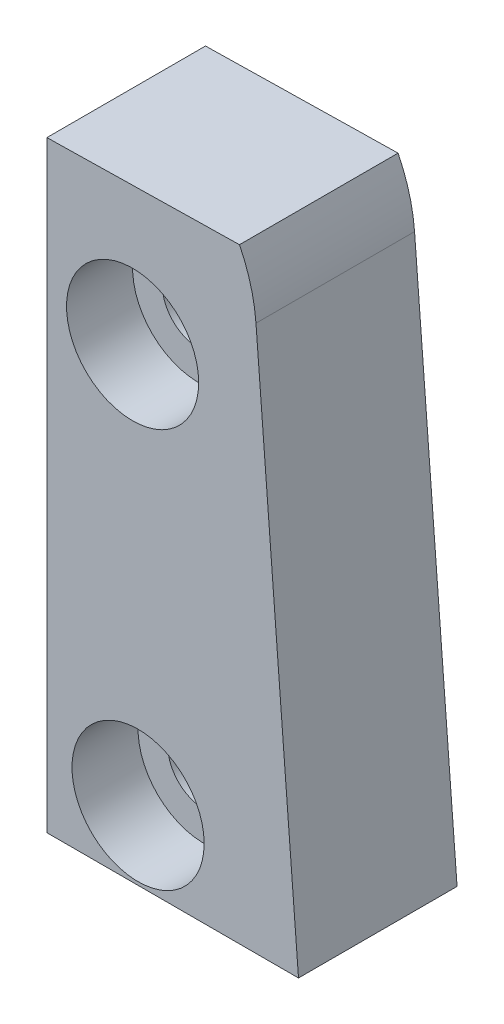
ISO-10303-21;
HEADER;
FILE_DESCRIPTION(('STEP AP214'),'2;1');
FILE_NAME('part.step','',(''),(''),'','','');
FILE_SCHEMA(('AUTOMOTIVE_DESIGN { 1 0 10303 214 1 1 1 1 }'));
ENDSEC;
DATA;
#1=APPLICATION_CONTEXT('core data for automotive mechanical design processes');
#2=APPLICATION_PROTOCOL_DEFINITION('international standard','automotive_design',2000,#1);
#3=PRODUCT_CONTEXT('',#1,'mechanical');
#4=PRODUCT('Part','Part','',(#3));
#5=PRODUCT_RELATED_PRODUCT_CATEGORY('part','',(#4));
#6=PRODUCT_DEFINITION_FORMATION('','',#4);
#7=PRODUCT_DEFINITION_CONTEXT('part definition',#1,'design');
#8=PRODUCT_DEFINITION('design','',#6,#7);
#9=PRODUCT_DEFINITION_SHAPE('','',#8);
#10=(LENGTH_UNIT() NAMED_UNIT(*) SI_UNIT(.MILLI.,.METRE.));
#11=(NAMED_UNIT(*) PLANE_ANGLE_UNIT() SI_UNIT($,.RADIAN.));
#12=(NAMED_UNIT(*) SI_UNIT($,.STERADIAN.) SOLID_ANGLE_UNIT());
#13=UNCERTAINTY_MEASURE_WITH_UNIT(LENGTH_MEASURE(1.E-05),#10,'distance_accuracy_value','');
#14=(GEOMETRIC_REPRESENTATION_CONTEXT(3) GLOBAL_UNCERTAINTY_ASSIGNED_CONTEXT((#13)) GLOBAL_UNIT_ASSIGNED_CONTEXT((#10,
#11,#12)) REPRESENTATION_CONTEXT('',''));
#15=CARTESIAN_POINT('',(0.,0.,0.));
#16=DIRECTION('',(0.,0.,1.));
#17=DIRECTION('',(1.,0.,0.));
#18=AXIS2_PLACEMENT_3D('',#15,#16,#17);
#19=CARTESIAN_POINT('',(-1.22382113356307,-7.59462182480509,4.8));
#20=DIRECTION('',(0.,0.,-1.));
#21=DIRECTION('',(-1.,0.,0.));
#22=AXIS2_PLACEMENT_3D('',#19,#20,#21);
#23=CYLINDRICAL_SURFACE('',#22,1.1);
#24=CARTESIAN_POINT('',(-1.22382113356307,-7.59462182480509,1.8));
#25=DIRECTION('',(0.,0.,1.));
#26=DIRECTION('',(1.,0.,0.));
#27=AXIS2_PLACEMENT_3D('',#24,#25,#26);
#28=CIRCLE('',#27,1.1);
#29=CARTESIAN_POINT('',(-0.123821133563065,-7.59462182480509,1.8));
#30=VERTEX_POINT('',#29);
#31=EDGE_CURVE('E209',#30,#30,#28,.T.);
#32=ORIENTED_EDGE('',*,*,#31,.F.);
#33=EDGE_LOOP('',(#32));
#34=FACE_BOUND('',#33,.T.);
#35=CARTESIAN_POINT('',(-1.22382113356307,-7.59462182480509,2.8));
#36=DIRECTION('',(0.,0.,1.));
#37=DIRECTION('',(1.,0.,0.));
#38=AXIS2_PLACEMENT_3D('',#35,#36,#37);
#39=CIRCLE('',#38,1.1);
#40=CARTESIAN_POINT('',(-0.123821133563065,-7.59462182480509,2.8));
#41=VERTEX_POINT('',#40);
#42=EDGE_CURVE('E47',#41,#41,#39,.T.);
#43=ORIENTED_EDGE('',*,*,#42,.T.);
#44=EDGE_LOOP('',(#43));
#45=FACE_BOUND('',#44,.T.);
#46=ADVANCED_FACE('F44',(#34,#45),#23,.F.);
#47=CARTESIAN_POINT('',(-1.38933849512214,4.40423662102307,4.8));
#48=DIRECTION('',(0.,0.,-1.));
#49=DIRECTION('',(-1.,0.,0.));
#50=AXIS2_PLACEMENT_3D('',#47,#48,#49);
#51=CYLINDRICAL_SURFACE('',#50,1.1);
#52=CARTESIAN_POINT('',(-1.38933849512214,4.40423662102307,1.8));
#53=DIRECTION('',(0.,0.,1.));
#54=DIRECTION('',(1.,0.,0.));
#55=AXIS2_PLACEMENT_3D('',#52,#53,#54);
#56=CIRCLE('',#55,1.1);
#57=CARTESIAN_POINT('',(-0.289338495122142,4.40423662102307,1.8));
#58=VERTEX_POINT('',#57);
#59=EDGE_CURVE('E203',#58,#58,#56,.T.);
#60=ORIENTED_EDGE('',*,*,#59,.F.);
#61=EDGE_LOOP('',(#60));
#62=FACE_BOUND('',#61,.T.);
#63=CARTESIAN_POINT('',(-1.38933849512214,4.40423662102307,2.8));
#64=DIRECTION('',(0.,0.,1.));
#65=DIRECTION('',(1.,0.,0.));
#66=AXIS2_PLACEMENT_3D('',#63,#64,#65);
#67=CIRCLE('',#66,1.1);
#68=CARTESIAN_POINT('',(-0.289338495122142,4.40423662102307,2.8));
#69=VERTEX_POINT('',#68);
#70=EDGE_CURVE('E299',#69,#69,#67,.T.);
#71=ORIENTED_EDGE('',*,*,#70,.T.);
#72=EDGE_LOOP('',(#71));
#73=FACE_BOUND('',#72,.T.);
#74=ADVANCED_FACE('F340',(#62,#73),#51,.F.);
#75=CARTESIAN_POINT('',(-2.56730969216806,6.44734427455029,1.8));
#76=DIRECTION('',(0.,0.,-1.));
#77=DIRECTION('',(-1.,0.,0.));
#78=AXIS2_PLACEMENT_3D('',#75,#76,#77);
#79=CYLINDRICAL_SURFACE('',#78,4.92699884637888);
#80=CARTESIAN_POINT('',(-2.56730969216806,6.44734427455029,0.));
#81=DIRECTION('',(0.,0.,1.));
#82=DIRECTION('',(1.,0.,0.));
#83=AXIS2_PLACEMENT_3D('',#80,#81,#82);
#84=CIRCLE('',#83,4.92699884637888);
#85=CARTESIAN_POINT('',(2.34480606853451,6.83001434873438,0.));
#86=VERTEX_POINT('',#85);
#87=CARTESIAN_POINT('',(1.84578532159205,8.63821397212351,0.));
#88=VERTEX_POINT('',#87);
#89=EDGE_CURVE('E248',#86,#88,#84,.T.);
#90=ORIENTED_EDGE('',*,*,#89,.T.);
#91=DIRECTION('',(0.,0.,-1.));
#92=VECTOR('',#91,1.);
#93=CARTESIAN_POINT('',(1.84578532159205,8.63821397212351,1.8));
#94=LINE('',#93,#92);
#95=CARTESIAN_POINT('',(1.84578532159204,8.6382139721235,4.8));
#96=VERTEX_POINT('',#95);
#97=EDGE_CURVE('E11',#96,#88,#94,.T.);
#98=ORIENTED_EDGE('',*,*,#97,.F.);
#99=CARTESIAN_POINT('',(-2.56730969216806,6.44734427455029,4.8));
#100=DIRECTION('',(0.,0.,1.));
#101=DIRECTION('',(1.,0.,0.));
#102=AXIS2_PLACEMENT_3D('',#99,#100,#101);
#103=CIRCLE('',#102,4.92699884637888);
#104=CARTESIAN_POINT('',(2.34480606853451,6.83001434873438,4.8));
#105=VERTEX_POINT('',#104);
#106=EDGE_CURVE('E228',#105,#96,#103,.T.);
#107=ORIENTED_EDGE('',*,*,#106,.F.);
#108=DIRECTION('',(0.,0.,-1.));
#109=VECTOR('',#108,1.);
#110=CARTESIAN_POINT('',(2.34480606853451,6.83001434873438,1.8));
#111=LINE('',#110,#109);
#112=EDGE_CURVE('E259',#105,#86,#111,.T.);
#113=ORIENTED_EDGE('',*,*,#112,.T.);
#114=EDGE_LOOP('',(#90,#98,#107,#113));
#115=FACE_BOUND('',#114,.T.);
#116=ADVANCED_FACE('F50',(#115),#79,.T.);
#117=CARTESIAN_POINT('',(-3.98264650724656,8.53179352333155,1.8));
#118=DIRECTION('',(0.0182558047915443,-0.999833348909414,0.));
#119=DIRECTION('',(0.999833348909414,0.0182558047915443,0.));
#120=AXIS2_PLACEMENT_3D('',#117,#118,#119);
#121=PLANE('',#120);
#122=DIRECTION('',(-0.999833348909413,-0.0182558047915443,0.));
#123=VECTOR('',#122,1.);
#124=CARTESIAN_POINT('',(-3.98264650724656,8.53179352333155,0.));
#125=LINE('',#124,#123);
#126=CARTESIAN_POINT('',(-3.98264650724656,8.53179352333155,0.));
#127=VERTEX_POINT('',#126);
#128=EDGE_CURVE('E263',#88,#127,#125,.T.);
#129=ORIENTED_EDGE('',*,*,#128,.T.);
#130=DIRECTION('',(0.,0.,-1.));
#131=VECTOR('',#130,1.);
#132=CARTESIAN_POINT('',(-3.98264650724656,8.53179352333155,1.8));
#133=LINE('',#132,#131);
#134=CARTESIAN_POINT('',(-3.98264650724656,8.53179352333155,1.8));
#135=VERTEX_POINT('',#134);
#136=EDGE_CURVE('E54',#135,#127,#133,.T.);
#137=ORIENTED_EDGE('',*,*,#136,.F.);
#138=DIRECTION('',(0.,0.,-1.));
#139=VECTOR('',#138,1.);
#140=CARTESIAN_POINT('',(-3.98264650724656,8.53179352333155,4.8));
#141=LINE('',#140,#139);
#142=CARTESIAN_POINT('',(-3.98264650724656,8.53179352333155,4.8));
#143=VERTEX_POINT('',#142);
#144=EDGE_CURVE('E241',#143,#135,#141,.T.);
#145=ORIENTED_EDGE('',*,*,#144,.F.);
#146=DIRECTION('',(-0.999833348909413,-0.0182558047915443,0.));
#147=VECTOR('',#146,1.);
#148=CARTESIAN_POINT('',(-3.98264650724656,8.53179352333155,4.8));
#149=LINE('',#148,#147);
#150=EDGE_CURVE('E214',#96,#143,#149,.T.);
#151=ORIENTED_EDGE('',*,*,#150,.F.);
#152=ORIENTED_EDGE('',*,*,#97,.T.);
#153=EDGE_LOOP('',(#129,#137,#145,#151,#152));
#154=FACE_BOUND('',#153,.T.);
#155=ADVANCED_FACE('F381',(#154),#121,.F.);
#156=CARTESIAN_POINT('',(-3.95959040027349,7.26905737387563,1.8));
#157=DIRECTION('',(0.999833348909414,0.0182558047915443,0.));
#158=DIRECTION('',(-0.0182558047915443,0.999833348909414,0.));
#159=AXIS2_PLACEMENT_3D('',#156,#157,#158);
#160=PLANE('',#159);
#161=DIRECTION('',(0.0182558047915443,-0.999833348909413,0.));
#162=VECTOR('',#161,1.);
#163=CARTESIAN_POINT('',(-3.95959040027349,7.26905737387563,0.));
#164=LINE('',#163,#162);
#165=CARTESIAN_POINT('',(-3.95959040027349,7.26905737387563,0.));
#166=VERTEX_POINT('',#165);
#167=EDGE_CURVE('E266',#127,#166,#164,.T.);
#168=ORIENTED_EDGE('',*,*,#167,.T.);
#169=DIRECTION('',(0.,0.,-1.));
#170=VECTOR('',#169,1.);
#171=CARTESIAN_POINT('',(-3.95959040027349,7.26905737387563,1.8));
#172=LINE('',#171,#170);
#173=CARTESIAN_POINT('',(-3.95959040027349,7.26905737387563,1.8));
#174=VERTEX_POINT('',#173);
#175=EDGE_CURVE('E292',#174,#166,#172,.T.);
#176=ORIENTED_EDGE('',*,*,#175,.F.);
#177=DIRECTION('',(0.0182558047915443,-0.999833348909413,0.));
#178=VECTOR('',#177,1.);
#179=CARTESIAN_POINT('',(-3.95959040027349,7.26905737387563,1.8));
#180=LINE('',#179,#178);
#181=EDGE_CURVE('E250',#135,#174,#180,.T.);
#182=ORIENTED_EDGE('',*,*,#181,.F.);
#183=ORIENTED_EDGE('',*,*,#136,.T.);
#184=EDGE_LOOP('',(#168,#176,#182,#183));
#185=FACE_BOUND('',#184,.T.);
#186=ADVANCED_FACE('F377',(#185),#160,.F.);
#187=CARTESIAN_POINT('',(1.97033803548242,7.35085733120917,1.8));
#188=DIRECTION('',(-0.0137931134632488,0.999904870485683,0.));
#189=DIRECTION('',(-0.999904870485683,-0.0137931134632488,0.));
#190=AXIS2_PLACEMENT_3D('',#187,#188,#189);
#191=PLANE('',#190);
#192=DIRECTION('',(0.999904870485683,0.0137931134632488,0.));
#193=VECTOR('',#192,1.);
#194=CARTESIAN_POINT('',(1.97033803548242,7.35085733120917,0.));
#195=LINE('',#194,#193);
#196=CARTESIAN_POINT('',(1.97033803548242,7.35085733120917,0.));
#197=VERTEX_POINT('',#196);
#198=EDGE_CURVE('E267',#166,#197,#195,.T.);
#199=ORIENTED_EDGE('',*,*,#198,.T.);
#200=DIRECTION('',(0.,0.,-1.));
#201=VECTOR('',#200,1.);
#202=CARTESIAN_POINT('',(1.97033803548242,7.35085733120917,1.8));
#203=LINE('',#202,#201);
#204=CARTESIAN_POINT('',(1.97033803548242,7.35085733120917,1.8));
#205=VERTEX_POINT('',#204);
#206=EDGE_CURVE('E75',#205,#197,#203,.T.);
#207=ORIENTED_EDGE('',*,*,#206,.F.);
#208=DIRECTION('',(0.999904870485683,0.0137931134632488,0.));
#209=VECTOR('',#208,1.);
#210=CARTESIAN_POINT('',(1.97033803548242,7.35085733120917,1.8));
#211=LINE('',#210,#209);
#212=EDGE_CURVE('E253',#174,#205,#211,.T.);
#213=ORIENTED_EDGE('',*,*,#212,.F.);
#214=ORIENTED_EDGE('',*,*,#175,.T.);
#215=EDGE_LOOP('',(#199,#207,#213,#214));
#216=FACE_BOUND('',#215,.T.);
#217=ADVANCED_FACE('F374',(#216),#191,.F.);
#218=CARTESIAN_POINT('',(2.20541631221245,-9.69068404915641,1.8));
#219=DIRECTION('',(0.999904870485683,0.0137931134632488,0.));
#220=DIRECTION('',(-0.0137931134632488,0.999904870485683,0.));
#221=AXIS2_PLACEMENT_3D('',#218,#219,#220);
#222=PLANE('',#221);
#223=DIRECTION('',(0.0137931134632488,-0.999904870485683,0.));
#224=VECTOR('',#223,1.);
#225=CARTESIAN_POINT('',(2.20541631221245,-9.69068404915641,0.));
#226=LINE('',#225,#224);
#227=CARTESIAN_POINT('',(2.20541631221245,-9.69068404915641,0.));
#228=VERTEX_POINT('',#227);
#229=EDGE_CURVE('E275',#197,#228,#226,.T.);
#230=ORIENTED_EDGE('',*,*,#229,.T.);
#231=DIRECTION('',(0.,0.,-1.));
#232=VECTOR('',#231,1.);
#233=CARTESIAN_POINT('',(2.20541631221245,-9.69068404915641,1.8));
#234=LINE('',#233,#232);
#235=CARTESIAN_POINT('',(2.20541631220053,-9.69068404915641,1.8));
#236=VERTEX_POINT('',#235);
#237=EDGE_CURVE('E282',#236,#228,#234,.T.);
#238=ORIENTED_EDGE('',*,*,#237,.F.);
#239=DIRECTION('',(0.0137931134625321,-0.999904870485693,0.));
#240=VECTOR('',#239,1.);
#241=CARTESIAN_POINT('',(1.97590192244876,6.94751419250535,1.8));
#242=LINE('',#241,#240);
#243=EDGE_CURVE('E254',#205,#236,#242,.T.);
#244=ORIENTED_EDGE('',*,*,#243,.F.);
#245=ORIENTED_EDGE('',*,*,#206,.T.);
#246=EDGE_LOOP('',(#230,#238,#244,#245));
#247=FACE_BOUND('',#246,.T.);
#248=ADVANCED_FACE('F371',(#247),#222,.F.);
#249=CARTESIAN_POINT('',(3.63182314823554,-9.69068404915641,1.8));
#250=DIRECTION('',(0.,1.,0.));
#251=DIRECTION('',(0.,0.,1.));
#252=AXIS2_PLACEMENT_3D('',#249,#250,#251);
#253=PLANE('',#252);
#254=DIRECTION('',(1.,0.,0.));
#255=VECTOR('',#254,1.);
#256=CARTESIAN_POINT('',(3.63182314823554,-9.69068404915641,0.));
#257=LINE('',#256,#255);
#258=CARTESIAN_POINT('',(3.63182314823554,-9.69068404915641,0.));
#259=VERTEX_POINT('',#258);
#260=EDGE_CURVE('E274',#228,#259,#257,.T.);
#261=ORIENTED_EDGE('',*,*,#260,.T.);
#262=DIRECTION('',(0.,0.,-1.));
#263=VECTOR('',#262,1.);
#264=CARTESIAN_POINT('',(3.63182314823554,-9.69068404915641,1.8));
#265=LINE('',#264,#263);
#266=CARTESIAN_POINT('',(3.63182314823554,-9.69068404915641,4.8));
#267=VERTEX_POINT('',#266);
#268=EDGE_CURVE('E281',#267,#259,#265,.T.);
#269=ORIENTED_EDGE('',*,*,#268,.F.);
#270=DIRECTION('',(1.,0.,0.));
#271=VECTOR('',#270,1.);
#272=CARTESIAN_POINT('',(-3.98264650724656,-9.69068404915641,4.8));
#273=LINE('',#272,#271);
#274=CARTESIAN_POINT('',(-3.98264650724656,-9.69068404915641,4.8));
#275=VERTEX_POINT('',#274);
#276=EDGE_CURVE('E225',#275,#267,#273,.T.);
#277=ORIENTED_EDGE('',*,*,#276,.F.);
#278=DIRECTION('',(0.,0.,-1.));
#279=VECTOR('',#278,1.);
#280=CARTESIAN_POINT('',(-3.98264650724656,-9.69068404915641,4.8));
#281=LINE('',#280,#279);
#282=CARTESIAN_POINT('',(-3.98264650724656,-9.69068404915641,1.8));
#283=VERTEX_POINT('',#282);
#284=EDGE_CURVE('E231',#275,#283,#281,.T.);
#285=ORIENTED_EDGE('',*,*,#284,.T.);
#286=DIRECTION('',(1.,0.,0.));
#287=VECTOR('',#286,1.);
#288=CARTESIAN_POINT('',(-3.98264650724656,-9.69068404915641,1.8));
#289=LINE('',#288,#287);
#290=EDGE_CURVE('E218',#283,#236,#289,.T.);
#291=ORIENTED_EDGE('',*,*,#290,.T.);
#292=ORIENTED_EDGE('',*,*,#237,.T.);
#293=EDGE_LOOP('',(#261,#269,#277,#285,#291,#292));
#294=FACE_BOUND('',#293,.T.);
#295=ADVANCED_FACE('F366',(#294),#253,.F.);
#296=CARTESIAN_POINT('',(2.34480606853451,6.83001434873438,1.8));
#297=DIRECTION('',(-0.996979279650689,-0.077667985342695,0.));
#298=DIRECTION('',(0.077667985342695,-0.996979279650689,0.));
#299=AXIS2_PLACEMENT_3D('',#296,#297,#298);
#300=PLANE('',#299);
#301=DIRECTION('',(-0.077667985342695,0.996979279650689,0.));
#302=VECTOR('',#301,1.);
#303=CARTESIAN_POINT('',(2.34480606853451,6.83001434873438,0.));
#304=LINE('',#303,#302);
#305=EDGE_CURVE('E103',#259,#86,#304,.T.);
#306=ORIENTED_EDGE('',*,*,#305,.T.);
#307=ORIENTED_EDGE('',*,*,#112,.F.);
#308=DIRECTION('',(-0.077667985342695,0.996979279650689,0.));
#309=VECTOR('',#308,1.);
#310=CARTESIAN_POINT('',(3.63182314823554,-9.69068404915641,4.8));
#311=LINE('',#310,#309);
#312=EDGE_CURVE('E229',#267,#105,#311,.T.);
#313=ORIENTED_EDGE('',*,*,#312,.F.);
#314=ORIENTED_EDGE('',*,*,#268,.T.);
#315=EDGE_LOOP('',(#306,#307,#313,#314));
#316=FACE_BOUND('',#315,.T.);
#317=ADVANCED_FACE('F365',(#316),#300,.F.);
#318=CARTESIAN_POINT('',(-2.56730969216806,6.44734427455029,0.));
#319=DIRECTION('',(0.,0.,1.));
#320=DIRECTION('',(1.,0.,0.));
#321=AXIS2_PLACEMENT_3D('',#318,#319,#320);
#322=PLANE('',#321);
#323=ORIENTED_EDGE('',*,*,#89,.F.);
#324=ORIENTED_EDGE('',*,*,#305,.F.);
#325=ORIENTED_EDGE('',*,*,#260,.F.);
#326=ORIENTED_EDGE('',*,*,#229,.F.);
#327=ORIENTED_EDGE('',*,*,#198,.F.);
#328=ORIENTED_EDGE('',*,*,#167,.F.);
#329=ORIENTED_EDGE('',*,*,#128,.F.);
#330=EDGE_LOOP('',(#323,#324,#325,#326,#327,#328,#329));
#331=FACE_BOUND('',#330,.T.);
#332=ADVANCED_FACE('F360',(#331),#322,.F.);
#333=CARTESIAN_POINT('',(-2.56730969216806,6.44734427455029,1.8));
#334=DIRECTION('',(0.,0.,1.));
#335=DIRECTION('',(1.,0.,0.));
#336=AXIS2_PLACEMENT_3D('',#333,#334,#335);
#337=PLANE('',#336);
#338=DIRECTION('',(0.,-1.,0.));
#339=VECTOR('',#338,1.);
#340=CARTESIAN_POINT('',(-0.290046652720409,-5.19991259085085,1.8));
#341=LINE('',#340,#339);
#342=CARTESIAN_POINT('',(-0.290046652720409,1.96939692509466,1.8));
#343=VERTEX_POINT('',#342);
#344=CARTESIAN_POINT('',(-0.290046652720409,-5.19991259085085,1.8));
#345=VERTEX_POINT('',#344);
#346=EDGE_CURVE('E195',#343,#345,#341,.T.);
#347=ORIENTED_EDGE('',*,*,#346,.F.);
#348=DIRECTION('',(1.,0.,0.));
#349=VECTOR('',#348,1.);
#350=CARTESIAN_POINT('',(-0.290046652720409,1.96939692509466,1.8));
#351=LINE('',#350,#349);
#352=CARTESIAN_POINT('',(-2.95356721591997,1.96939692509466,1.8));
#353=VERTEX_POINT('',#352);
#354=EDGE_CURVE('E65',#353,#343,#351,.T.);
#355=ORIENTED_EDGE('',*,*,#354,.F.);
#356=DIRECTION('',(0.,1.,0.));
#357=VECTOR('',#356,1.);
#358=CARTESIAN_POINT('',(-2.95356721591997,-5.19991259085085,1.8));
#359=LINE('',#358,#357);
#360=CARTESIAN_POINT('',(-2.95356721591997,-5.19991259085085,1.8));
#361=VERTEX_POINT('',#360);
#362=EDGE_CURVE('E173',#361,#353,#359,.T.);
#363=ORIENTED_EDGE('',*,*,#362,.F.);
#364=DIRECTION('',(-1.,0.,0.));
#365=VECTOR('',#364,1.);
#366=CARTESIAN_POINT('',(-0.290046652720409,-5.19991259085085,1.8));
#367=LINE('',#366,#365);
#368=EDGE_CURVE('E179',#345,#361,#367,.T.);
#369=ORIENTED_EDGE('',*,*,#368,.F.);
#370=EDGE_LOOP('',(#347,#355,#363,#369));
#371=FACE_BOUND('',#370,.T.);
#372=ORIENTED_EDGE('',*,*,#31,.T.);
#373=EDGE_LOOP('',(#372));
#374=FACE_BOUND('',#373,.T.);
#375=ORIENTED_EDGE('',*,*,#59,.T.);
#376=EDGE_LOOP('',(#375));
#377=FACE_BOUND('',#376,.T.);
#378=DIRECTION('',(0.,-1.,0.));
#379=VECTOR('',#378,1.);
#380=CARTESIAN_POINT('',(-3.98264650724656,8.53179352333155,1.8));
#381=LINE('',#380,#379);
#382=EDGE_CURVE('E212',#135,#283,#381,.T.);
#383=ORIENTED_EDGE('',*,*,#382,.F.);
#384=ORIENTED_EDGE('',*,*,#181,.T.);
#385=ORIENTED_EDGE('',*,*,#212,.T.);
#386=ORIENTED_EDGE('',*,*,#243,.T.);
#387=ORIENTED_EDGE('',*,*,#290,.F.);
#388=EDGE_LOOP('',(#383,#384,#385,#386,#387));
#389=FACE_BOUND('',#388,.T.);
#390=ADVANCED_FACE('F355',(#371,#374,#377,#389),#337,.F.);
#391=CARTESIAN_POINT('',(-2.56730969216806,6.44734427455029,4.8));
#392=DIRECTION('',(0.,0.,1.));
#393=DIRECTION('',(1.,0.,0.));
#394=AXIS2_PLACEMENT_3D('',#391,#392,#393);
#395=PLANE('',#394);
#396=CARTESIAN_POINT('',(-1.38933849512214,4.40423662102307,4.8));
#397=DIRECTION('',(0.,0.,1.));
#398=DIRECTION('',(1.,0.,0.));
#399=AXIS2_PLACEMENT_3D('',#396,#397,#398);
#400=CIRCLE('',#399,2.);
#401=CARTESIAN_POINT('',(0.610661504877857,4.40423662102307,4.8));
#402=VERTEX_POINT('',#401);
#403=EDGE_CURVE('E308',#402,#402,#400,.T.);
#404=ORIENTED_EDGE('',*,*,#403,.F.);
#405=EDGE_LOOP('',(#404));
#406=FACE_BOUND('',#405,.T.);
#407=CARTESIAN_POINT('',(-1.22382113356307,-7.59462182480509,4.8));
#408=DIRECTION('',(0.,0.,1.));
#409=DIRECTION('',(1.,0.,0.));
#410=AXIS2_PLACEMENT_3D('',#407,#408,#409);
#411=CIRCLE('',#410,2.);
#412=CARTESIAN_POINT('',(0.776178866436935,-7.59462182480509,4.8));
#413=VERTEX_POINT('',#412);
#414=EDGE_CURVE('E315',#413,#413,#411,.T.);
#415=ORIENTED_EDGE('',*,*,#414,.F.);
#416=EDGE_LOOP('',(#415));
#417=FACE_BOUND('',#416,.T.);
#418=ORIENTED_EDGE('',*,*,#150,.T.);
#419=DIRECTION('',(0.,-1.,0.));
#420=VECTOR('',#419,1.);
#421=CARTESIAN_POINT('',(-3.98264650724656,8.53179352333155,4.8));
#422=LINE('',#421,#420);
#423=EDGE_CURVE('E217',#143,#275,#422,.T.);
#424=ORIENTED_EDGE('',*,*,#423,.T.);
#425=ORIENTED_EDGE('',*,*,#276,.T.);
#426=ORIENTED_EDGE('',*,*,#312,.T.);
#427=ORIENTED_EDGE('',*,*,#106,.T.);
#428=EDGE_LOOP('',(#418,#424,#425,#426,#427));
#429=FACE_BOUND('',#428,.T.);
#430=ADVANCED_FACE('F349',(#406,#417,#429),#395,.T.);
#431=CARTESIAN_POINT('',(-3.98264650724656,8.53179352333155,4.8));
#432=DIRECTION('',(1.,0.,0.));
#433=DIRECTION('',(0.,0.,-1.));
#434=AXIS2_PLACEMENT_3D('',#431,#432,#433);
#435=PLANE('',#434);
#436=ORIENTED_EDGE('',*,*,#382,.T.);
#437=ORIENTED_EDGE('',*,*,#284,.F.);
#438=ORIENTED_EDGE('',*,*,#423,.F.);
#439=ORIENTED_EDGE('',*,*,#144,.T.);
#440=EDGE_LOOP('',(#436,#437,#438,#439));
#441=FACE_BOUND('',#440,.T.);
#442=ADVANCED_FACE('F351',(#441),#435,.F.);
#443=CARTESIAN_POINT('',(-0.290046652720409,1.96939692509466,3.8));
#444=DIRECTION('',(0.,1.,0.));
#445=DIRECTION('',(-1.,0.,0.));
#446=AXIS2_PLACEMENT_3D('',#443,#444,#445);
#447=PLANE('',#446);
#448=ORIENTED_EDGE('',*,*,#354,.T.);
#449=DIRECTION('',(0.,0.,-1.));
#450=VECTOR('',#449,1.);
#451=CARTESIAN_POINT('',(-0.290046652720409,1.96939692509466,3.8));
#452=LINE('',#451,#450);
#453=CARTESIAN_POINT('',(-0.290046652720409,1.96939692509466,3.8));
#454=VERTEX_POINT('',#453);
#455=EDGE_CURVE('E149',#454,#343,#452,.T.);
#456=ORIENTED_EDGE('',*,*,#455,.F.);
#457=DIRECTION('',(1.,0.,0.));
#458=VECTOR('',#457,1.);
#459=CARTESIAN_POINT('',(-0.290046652720409,1.96939692509466,3.8));
#460=LINE('',#459,#458);
#461=CARTESIAN_POINT('',(-2.95356721591997,1.96939692509466,3.8));
#462=VERTEX_POINT('',#461);
#463=EDGE_CURVE('E153',#462,#454,#460,.T.);
#464=ORIENTED_EDGE('',*,*,#463,.F.);
#465=DIRECTION('',(0.,0.,-1.));
#466=VECTOR('',#465,1.);
#467=CARTESIAN_POINT('',(-2.95356721591997,1.96939692509466,3.8));
#468=LINE('',#467,#466);
#469=EDGE_CURVE('E196',#462,#353,#468,.T.);
#470=ORIENTED_EDGE('',*,*,#469,.T.);
#471=EDGE_LOOP('',(#448,#456,#464,#470));
#472=FACE_BOUND('',#471,.T.);
#473=ADVANCED_FACE('F151',(#472),#447,.F.);
#474=CARTESIAN_POINT('',(-2.95356721591997,-5.19991259085085,3.8));
#475=DIRECTION('',(-1.,0.,0.));
#476=DIRECTION('',(0.,0.,1.));
#477=AXIS2_PLACEMENT_3D('',#474,#475,#476);
#478=PLANE('',#477);
#479=ORIENTED_EDGE('',*,*,#362,.T.);
#480=ORIENTED_EDGE('',*,*,#469,.F.);
#481=DIRECTION('',(0.,1.,0.));
#482=VECTOR('',#481,1.);
#483=CARTESIAN_POINT('',(-2.95356721591997,-5.19991259085085,3.8));
#484=LINE('',#483,#482);
#485=CARTESIAN_POINT('',(-2.95356721591997,-5.19991259085085,3.8));
#486=VERTEX_POINT('',#485);
#487=EDGE_CURVE('E159',#486,#462,#484,.T.);
#488=ORIENTED_EDGE('',*,*,#487,.F.);
#489=DIRECTION('',(0.,0.,-1.));
#490=VECTOR('',#489,1.);
#491=CARTESIAN_POINT('',(-2.95356721591997,-5.19991259085085,3.8));
#492=LINE('',#491,#490);
#493=EDGE_CURVE('E205',#486,#361,#492,.T.);
#494=ORIENTED_EDGE('',*,*,#493,.T.);
#495=EDGE_LOOP('',(#479,#480,#488,#494));
#496=FACE_BOUND('',#495,.T.);
#497=ADVANCED_FACE('F477',(#496),#478,.F.);
#498=CARTESIAN_POINT('',(-0.290046652720409,-5.19991259085085,3.8));
#499=DIRECTION('',(0.,-1.,0.));
#500=DIRECTION('',(1.,0.,0.));
#501=AXIS2_PLACEMENT_3D('',#498,#499,#500);
#502=PLANE('',#501);
#503=ORIENTED_EDGE('',*,*,#368,.T.);
#504=ORIENTED_EDGE('',*,*,#493,.F.);
#505=DIRECTION('',(-1.,0.,0.));
#506=VECTOR('',#505,1.);
#507=CARTESIAN_POINT('',(-0.290046652720409,-5.19991259085085,3.8));
#508=LINE('',#507,#506);
#509=CARTESIAN_POINT('',(-0.290046652720409,-5.19991259085085,3.8));
#510=VERTEX_POINT('',#509);
#511=EDGE_CURVE('E166',#510,#486,#508,.T.);
#512=ORIENTED_EDGE('',*,*,#511,.F.);
#513=DIRECTION('',(0.,0.,-1.));
#514=VECTOR('',#513,1.);
#515=CARTESIAN_POINT('',(-0.290046652720409,-5.19991259085085,3.8));
#516=LINE('',#515,#514);
#517=EDGE_CURVE('E157',#510,#345,#516,.T.);
#518=ORIENTED_EDGE('',*,*,#517,.T.);
#519=EDGE_LOOP('',(#503,#504,#512,#518));
#520=FACE_BOUND('',#519,.T.);
#521=ADVANCED_FACE('F469',(#520),#502,.F.);
#522=CARTESIAN_POINT('',(-0.290046652720409,-5.19991259085085,3.8));
#523=DIRECTION('',(1.,0.,0.));
#524=DIRECTION('',(0.,0.,-1.));
#525=AXIS2_PLACEMENT_3D('',#522,#523,#524);
#526=PLANE('',#525);
#527=ORIENTED_EDGE('',*,*,#346,.T.);
#528=ORIENTED_EDGE('',*,*,#517,.F.);
#529=DIRECTION('',(0.,-1.,0.));
#530=VECTOR('',#529,1.);
#531=CARTESIAN_POINT('',(-0.290046652720409,-5.19991259085085,3.8));
#532=LINE('',#531,#530);
#533=EDGE_CURVE('E162',#454,#510,#532,.T.);
#534=ORIENTED_EDGE('',*,*,#533,.F.);
#535=ORIENTED_EDGE('',*,*,#455,.T.);
#536=EDGE_LOOP('',(#527,#528,#534,#535));
#537=FACE_BOUND('',#536,.T.);
#538=ADVANCED_FACE('F163',(#537),#526,.F.);
#539=CARTESIAN_POINT('',(0.,0.,3.8));
#540=DIRECTION('',(0.,0.,-1.));
#541=DIRECTION('',(-1.,0.,0.));
#542=AXIS2_PLACEMENT_3D('',#539,#540,#541);
#543=PLANE('',#542);
#544=ORIENTED_EDGE('',*,*,#463,.T.);
#545=ORIENTED_EDGE('',*,*,#533,.T.);
#546=ORIENTED_EDGE('',*,*,#511,.T.);
#547=ORIENTED_EDGE('',*,*,#487,.T.);
#548=EDGE_LOOP('',(#544,#545,#546,#547));
#549=FACE_BOUND('',#548,.T.);
#550=ADVANCED_FACE('F174',(#549),#543,.T.);
#551=CARTESIAN_POINT('',(-1.38933849512214,4.40423662102307,2.8));
#552=DIRECTION('',(0.,0.,1.));
#553=DIRECTION('',(1.,0.,0.));
#554=AXIS2_PLACEMENT_3D('',#551,#552,#553);
#555=CYLINDRICAL_SURFACE('',#554,2.);
#556=CARTESIAN_POINT('',(-1.38933849512214,4.40423662102307,2.8));
#557=DIRECTION('',(0.,0.,1.));
#558=DIRECTION('',(1.,0.,0.));
#559=AXIS2_PLACEMENT_3D('',#556,#557,#558);
#560=CIRCLE('',#559,2.);
#561=CARTESIAN_POINT('',(0.610661504877857,4.40423662102307,2.8));
#562=VERTEX_POINT('',#561);
#563=EDGE_CURVE('E298',#562,#562,#560,.T.);
#564=ORIENTED_EDGE('',*,*,#563,.F.);
#565=EDGE_LOOP('',(#564));
#566=FACE_BOUND('',#565,.T.);
#567=ORIENTED_EDGE('',*,*,#403,.T.);
#568=EDGE_LOOP('',(#567));
#569=FACE_BOUND('',#568,.T.);
#570=ADVANCED_FACE('F334',(#566,#569),#555,.F.);
#571=CARTESIAN_POINT('',(-1.38933849512214,4.40423662102307,2.8));
#572=DIRECTION('',(0.,0.,1.));
#573=DIRECTION('',(1.,0.,0.));
#574=AXIS2_PLACEMENT_3D('',#571,#572,#573);
#575=PLANE('',#574);
#576=ORIENTED_EDGE('',*,*,#70,.F.);
#577=EDGE_LOOP('',(#576));
#578=FACE_BOUND('',#577,.T.);
#579=ORIENTED_EDGE('',*,*,#563,.T.);
#580=EDGE_LOOP('',(#579));
#581=FACE_BOUND('',#580,.T.);
#582=ADVANCED_FACE('F326',(#578,#581),#575,.T.);
#583=CARTESIAN_POINT('',(-1.22382113356307,-7.59462182480509,2.8));
#584=DIRECTION('',(0.,0.,1.));
#585=DIRECTION('',(1.,0.,0.));
#586=AXIS2_PLACEMENT_3D('',#583,#584,#585);
#587=CYLINDRICAL_SURFACE('',#586,2.);
#588=CARTESIAN_POINT('',(-1.22382113356307,-7.59462182480509,2.8));
#589=DIRECTION('',(0.,0.,1.));
#590=DIRECTION('',(1.,0.,0.));
#591=AXIS2_PLACEMENT_3D('',#588,#589,#590);
#592=CIRCLE('',#591,2.);
#593=CARTESIAN_POINT('',(0.776178866436935,-7.59462182480509,2.8));
#594=VERTEX_POINT('',#593);
#595=EDGE_CURVE('E181',#594,#594,#592,.T.);
#596=ORIENTED_EDGE('',*,*,#595,.F.);
#597=EDGE_LOOP('',(#596));
#598=FACE_BOUND('',#597,.T.);
#599=ORIENTED_EDGE('',*,*,#414,.T.);
#600=EDGE_LOOP('',(#599));
#601=FACE_BOUND('',#600,.T.);
#602=ADVANCED_FACE('F322',(#598,#601),#587,.F.);
#603=CARTESIAN_POINT('',(-1.22382113356307,-7.59462182480509,2.8));
#604=DIRECTION('',(0.,0.,1.));
#605=DIRECTION('',(1.,0.,0.));
#606=AXIS2_PLACEMENT_3D('',#603,#604,#605);
#607=PLANE('',#606);
#608=ORIENTED_EDGE('',*,*,#42,.F.);
#609=EDGE_LOOP('',(#608));
#610=FACE_BOUND('',#609,.T.);
#611=ORIENTED_EDGE('',*,*,#595,.T.);
#612=EDGE_LOOP('',(#611));
#613=FACE_BOUND('',#612,.T.);
#614=ADVANCED_FACE('F325',(#610,#613),#607,.T.);
#615=CLOSED_SHELL('',(#46,#74,#116,#155,#186,#217,#248,#295,#317,#332,#390,#430,#442,#473,#497,
#521,#538,#550,#570,#582,#602,#614));
#616=MANIFOLD_SOLID_BREP('B2',#615);
#617=ADVANCED_BREP_SHAPE_REPRESENTATION('',(#18,#616),#14);
#618=SHAPE_DEFINITION_REPRESENTATION(#9,#617);
ENDSEC;
END-ISO-10303-21;
